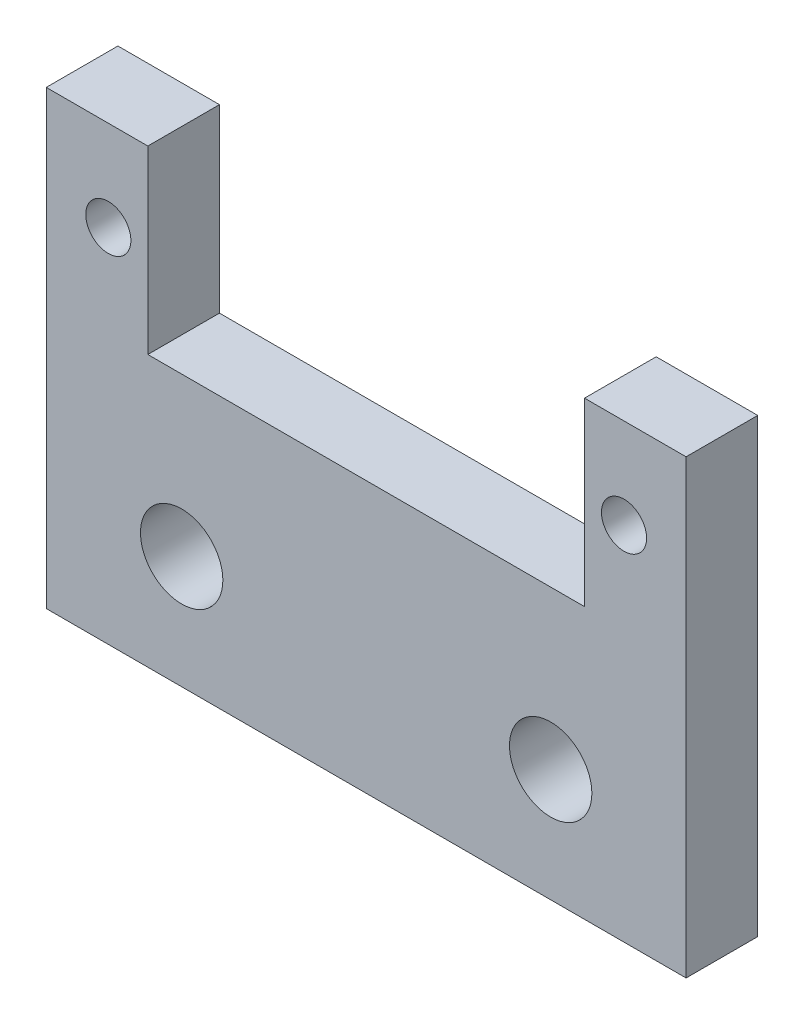
ISO-10303-21;
HEADER;
FILE_DESCRIPTION(('STEP AP214'),'2;1');
FILE_NAME('part.step','',(''),(''),'','','');
FILE_SCHEMA(('AUTOMOTIVE_DESIGN { 1 0 10303 214 1 1 1 1 }'));
ENDSEC;
DATA;
#1=APPLICATION_CONTEXT('core data for automotive mechanical design processes');
#2=APPLICATION_PROTOCOL_DEFINITION('international standard','automotive_design',2000,#1);
#3=PRODUCT_CONTEXT('',#1,'mechanical');
#4=PRODUCT('Part','Part','',(#3));
#5=PRODUCT_RELATED_PRODUCT_CATEGORY('part','',(#4));
#6=PRODUCT_DEFINITION_FORMATION('','',#4);
#7=PRODUCT_DEFINITION_CONTEXT('part definition',#1,'design');
#8=PRODUCT_DEFINITION('design','',#6,#7);
#9=PRODUCT_DEFINITION_SHAPE('','',#8);
#10=(LENGTH_UNIT() NAMED_UNIT(*) SI_UNIT(.MILLI.,.METRE.));
#11=(NAMED_UNIT(*) PLANE_ANGLE_UNIT() SI_UNIT($,.RADIAN.));
#12=(NAMED_UNIT(*) SI_UNIT($,.STERADIAN.) SOLID_ANGLE_UNIT());
#13=UNCERTAINTY_MEASURE_WITH_UNIT(LENGTH_MEASURE(1.E-05),#10,'distance_accuracy_value','');
#14=(GEOMETRIC_REPRESENTATION_CONTEXT(3) GLOBAL_UNCERTAINTY_ASSIGNED_CONTEXT((#13)) GLOBAL_UNIT_ASSIGNED_CONTEXT((#10,
#11,#12)) REPRESENTATION_CONTEXT('',''));
#15=CARTESIAN_POINT('',(0.,0.,0.));
#16=DIRECTION('',(0.,0.,1.));
#17=DIRECTION('',(1.,0.,0.));
#18=AXIS2_PLACEMENT_3D('',#15,#16,#17);
#19=CARTESIAN_POINT('',(0.,0.,3.175));
#20=DIRECTION('',(0.,0.,-1.));
#21=DIRECTION('',(-1.,0.,0.));
#22=AXIS2_PLACEMENT_3D('',#19,#20,#21);
#23=PLANE('',#22);
#24=DIRECTION('',(-1.,0.,0.));
#25=VECTOR('',#24,1.);
#26=CARTESIAN_POINT('',(0.,8.,3.175));
#27=LINE('',#26,#25);
#28=CARTESIAN_POINT('',(4.5,8.,3.175));
#29=VERTEX_POINT('',#28);
#30=CARTESIAN_POINT('',(0.,8.,3.175));
#31=VERTEX_POINT('',#30);
#32=EDGE_CURVE('E144',#29,#31,#27,.T.);
#33=ORIENTED_EDGE('',*,*,#32,.T.);
#34=DIRECTION('',(0.,-1.,0.));
#35=VECTOR('',#34,1.);
#36=CARTESIAN_POINT('',(0.,8.,3.175));
#37=LINE('',#36,#35);
#38=CARTESIAN_POINT('',(0.,-12.,3.175));
#39=VERTEX_POINT('',#38);
#40=EDGE_CURVE('E92',#31,#39,#37,.T.);
#41=ORIENTED_EDGE('',*,*,#40,.T.);
#42=DIRECTION('',(1.,0.,0.));
#43=VECTOR('',#42,1.);
#44=CARTESIAN_POINT('',(28.35,-12.,3.175));
#45=LINE('',#44,#43);
#46=CARTESIAN_POINT('',(28.35,-12.,3.175));
#47=VERTEX_POINT('',#46);
#48=EDGE_CURVE('E159',#39,#47,#45,.T.);
#49=ORIENTED_EDGE('',*,*,#48,.T.);
#50=DIRECTION('',(0.,1.,0.));
#51=VECTOR('',#50,1.);
#52=CARTESIAN_POINT('',(28.35,8.,3.175));
#53=LINE('',#52,#51);
#54=CARTESIAN_POINT('',(28.35,8.,3.175));
#55=VERTEX_POINT('',#54);
#56=EDGE_CURVE('E172',#47,#55,#53,.T.);
#57=ORIENTED_EDGE('',*,*,#56,.T.);
#58=DIRECTION('',(-1.,0.,0.));
#59=VECTOR('',#58,1.);
#60=CARTESIAN_POINT('',(23.85,8.,3.175));
#61=LINE('',#60,#59);
#62=CARTESIAN_POINT('',(23.85,8.,3.175));
#63=VERTEX_POINT('',#62);
#64=EDGE_CURVE('E111',#55,#63,#61,.T.);
#65=ORIENTED_EDGE('',*,*,#64,.T.);
#66=DIRECTION('',(0.,-1.,0.));
#67=VECTOR('',#66,1.);
#68=CARTESIAN_POINT('',(23.85,0.,3.175));
#69=LINE('',#68,#67);
#70=CARTESIAN_POINT('',(23.85,0.,3.175));
#71=VERTEX_POINT('',#70);
#72=EDGE_CURVE('E105',#63,#71,#69,.T.);
#73=ORIENTED_EDGE('',*,*,#72,.T.);
#74=DIRECTION('',(-1.,0.,0.));
#75=VECTOR('',#74,1.);
#76=CARTESIAN_POINT('',(4.5,0.,3.175));
#77=LINE('',#76,#75);
#78=CARTESIAN_POINT('',(4.5,0.,3.175));
#79=VERTEX_POINT('',#78);
#80=EDGE_CURVE('E109',#71,#79,#77,.T.);
#81=ORIENTED_EDGE('',*,*,#80,.T.);
#82=DIRECTION('',(0.,1.,0.));
#83=VECTOR('',#82,1.);
#84=CARTESIAN_POINT('',(4.5,8.,3.175));
#85=LINE('',#84,#83);
#86=EDGE_CURVE('E49',#79,#29,#85,.T.);
#87=ORIENTED_EDGE('',*,*,#86,.T.);
#88=EDGE_LOOP('',(#33,#41,#49,#57,#65,#73,#81,#87));
#89=FACE_BOUND('',#88,.T.);
#90=CARTESIAN_POINT('',(2.75,4.,3.175));
#91=DIRECTION('',(0.,0.,1.));
#92=DIRECTION('',(1.,0.,0.));
#93=AXIS2_PLACEMENT_3D('',#90,#91,#92);
#94=CIRCLE('',#93,1.);
#95=CARTESIAN_POINT('',(3.75,4.,3.175));
#96=VERTEX_POINT('',#95);
#97=EDGE_CURVE('E133',#96,#96,#94,.T.);
#98=ORIENTED_EDGE('',*,*,#97,.F.);
#99=EDGE_LOOP('',(#98));
#100=FACE_BOUND('',#99,.T.);
#101=CARTESIAN_POINT('',(25.6,4.,3.175));
#102=DIRECTION('',(0.,0.,1.));
#103=DIRECTION('',(1.,0.,0.));
#104=AXIS2_PLACEMENT_3D('',#101,#102,#103);
#105=CIRCLE('',#104,0.999999999999998);
#106=CARTESIAN_POINT('',(26.6,4.,3.175));
#107=VERTEX_POINT('',#106);
#108=EDGE_CURVE('E181',#107,#107,#105,.T.);
#109=ORIENTED_EDGE('',*,*,#108,.F.);
#110=EDGE_LOOP('',(#109));
#111=FACE_BOUND('',#110,.T.);
#112=CARTESIAN_POINT('',(6.,-7.,3.175));
#113=DIRECTION('',(0.,0.,1.));
#114=DIRECTION('',(1.,0.,0.));
#115=AXIS2_PLACEMENT_3D('',#112,#113,#114);
#116=CIRCLE('',#115,1.825);
#117=CARTESIAN_POINT('',(7.825,-7.,3.175));
#118=VERTEX_POINT('',#117);
#119=EDGE_CURVE('E187',#118,#118,#116,.T.);
#120=ORIENTED_EDGE('',*,*,#119,.F.);
#121=EDGE_LOOP('',(#120));
#122=FACE_BOUND('',#121,.T.);
#123=CARTESIAN_POINT('',(22.35,-7.,3.175));
#124=DIRECTION('',(0.,0.,1.));
#125=DIRECTION('',(1.,0.,0.));
#126=AXIS2_PLACEMENT_3D('',#123,#124,#125);
#127=CIRCLE('',#126,1.825);
#128=CARTESIAN_POINT('',(24.175,-7.,3.175));
#129=VERTEX_POINT('',#128);
#130=EDGE_CURVE('E193',#129,#129,#127,.T.);
#131=ORIENTED_EDGE('',*,*,#130,.F.);
#132=EDGE_LOOP('',(#131));
#133=FACE_BOUND('',#132,.T.);
#134=ADVANCED_FACE('F32',(#89,#100,#111,#122,#133),#23,.F.);
#135=CARTESIAN_POINT('',(0.,0.,0.));
#136=DIRECTION('',(0.,0.,-1.));
#137=DIRECTION('',(-1.,0.,0.));
#138=AXIS2_PLACEMENT_3D('',#135,#136,#137);
#139=PLANE('',#138);
#140=CARTESIAN_POINT('',(6.,-7.,0.));
#141=DIRECTION('',(0.,0.,1.));
#142=DIRECTION('',(1.,0.,0.));
#143=AXIS2_PLACEMENT_3D('',#140,#141,#142);
#144=CIRCLE('',#143,1.825);
#145=CARTESIAN_POINT('',(7.825,-7.,0.));
#146=VERTEX_POINT('',#145);
#147=EDGE_CURVE('E190',#146,#146,#144,.T.);
#148=ORIENTED_EDGE('',*,*,#147,.T.);
#149=EDGE_LOOP('',(#148));
#150=FACE_BOUND('',#149,.T.);
#151=CARTESIAN_POINT('',(2.75,4.,0.));
#152=DIRECTION('',(0.,0.,1.));
#153=DIRECTION('',(1.,0.,0.));
#154=AXIS2_PLACEMENT_3D('',#151,#152,#153);
#155=CIRCLE('',#154,1.);
#156=CARTESIAN_POINT('',(3.75,4.,0.));
#157=VERTEX_POINT('',#156);
#158=EDGE_CURVE('E178',#157,#157,#155,.T.);
#159=ORIENTED_EDGE('',*,*,#158,.T.);
#160=EDGE_LOOP('',(#159));
#161=FACE_BOUND('',#160,.T.);
#162=DIRECTION('',(-1.,0.,0.));
#163=VECTOR('',#162,1.);
#164=CARTESIAN_POINT('',(0.,8.,0.));
#165=LINE('',#164,#163);
#166=CARTESIAN_POINT('',(4.5,8.,0.));
#167=VERTEX_POINT('',#166);
#168=CARTESIAN_POINT('',(0.,8.,0.));
#169=VERTEX_POINT('',#168);
#170=EDGE_CURVE('E129',#167,#169,#165,.T.);
#171=ORIENTED_EDGE('',*,*,#170,.F.);
#172=DIRECTION('',(0.,1.,0.));
#173=VECTOR('',#172,1.);
#174=CARTESIAN_POINT('',(4.5,8.,0.));
#175=LINE('',#174,#173);
#176=CARTESIAN_POINT('',(4.5,0.,0.));
#177=VERTEX_POINT('',#176);
#178=EDGE_CURVE('E84',#177,#167,#175,.T.);
#179=ORIENTED_EDGE('',*,*,#178,.F.);
#180=DIRECTION('',(-1.,0.,0.));
#181=VECTOR('',#180,1.);
#182=CARTESIAN_POINT('',(4.5,0.,0.));
#183=LINE('',#182,#181);
#184=CARTESIAN_POINT('',(23.85,0.,0.));
#185=VERTEX_POINT('',#184);
#186=EDGE_CURVE('E78',#185,#177,#183,.T.);
#187=ORIENTED_EDGE('',*,*,#186,.F.);
#188=DIRECTION('',(0.,-1.,0.));
#189=VECTOR('',#188,1.);
#190=CARTESIAN_POINT('',(23.85,0.,0.));
#191=LINE('',#190,#189);
#192=CARTESIAN_POINT('',(23.85,8.,0.));
#193=VERTEX_POINT('',#192);
#194=EDGE_CURVE('E119',#193,#185,#191,.T.);
#195=ORIENTED_EDGE('',*,*,#194,.F.);
#196=DIRECTION('',(-1.,0.,0.));
#197=VECTOR('',#196,1.);
#198=CARTESIAN_POINT('',(23.85,8.,0.));
#199=LINE('',#198,#197);
#200=CARTESIAN_POINT('',(28.35,8.,0.));
#201=VERTEX_POINT('',#200);
#202=EDGE_CURVE('E139',#201,#193,#199,.T.);
#203=ORIENTED_EDGE('',*,*,#202,.F.);
#204=DIRECTION('',(0.,1.,0.));
#205=VECTOR('',#204,1.);
#206=CARTESIAN_POINT('',(28.35,8.,0.));
#207=LINE('',#206,#205);
#208=CARTESIAN_POINT('',(28.35,-12.,0.));
#209=VERTEX_POINT('',#208);
#210=EDGE_CURVE('E137',#209,#201,#207,.T.);
#211=ORIENTED_EDGE('',*,*,#210,.F.);
#212=DIRECTION('',(1.,0.,0.));
#213=VECTOR('',#212,1.);
#214=CARTESIAN_POINT('',(28.35,-12.,0.));
#215=LINE('',#214,#213);
#216=CARTESIAN_POINT('',(0.,-12.,0.));
#217=VERTEX_POINT('',#216);
#218=EDGE_CURVE('E135',#217,#209,#215,.T.);
#219=ORIENTED_EDGE('',*,*,#218,.F.);
#220=DIRECTION('',(0.,-1.,0.));
#221=VECTOR('',#220,1.);
#222=CARTESIAN_POINT('',(0.,-12.,0.));
#223=LINE('',#222,#221);
#224=EDGE_CURVE('E132',#169,#217,#223,.T.);
#225=ORIENTED_EDGE('',*,*,#224,.F.);
#226=EDGE_LOOP('',(#171,#179,#187,#195,#203,#211,#219,#225));
#227=FACE_BOUND('',#226,.T.);
#228=CARTESIAN_POINT('',(25.6,4.,0.));
#229=DIRECTION('',(0.,0.,1.));
#230=DIRECTION('',(1.,0.,0.));
#231=AXIS2_PLACEMENT_3D('',#228,#229,#230);
#232=CIRCLE('',#231,0.999999999999998);
#233=CARTESIAN_POINT('',(26.6,4.,0.));
#234=VERTEX_POINT('',#233);
#235=EDGE_CURVE('E184',#234,#234,#232,.T.);
#236=ORIENTED_EDGE('',*,*,#235,.T.);
#237=EDGE_LOOP('',(#236));
#238=FACE_BOUND('',#237,.T.);
#239=CARTESIAN_POINT('',(22.35,-7.,0.));
#240=DIRECTION('',(0.,0.,1.));
#241=DIRECTION('',(1.,0.,0.));
#242=AXIS2_PLACEMENT_3D('',#239,#240,#241);
#243=CIRCLE('',#242,1.825);
#244=CARTESIAN_POINT('',(24.175,-7.,0.));
#245=VERTEX_POINT('',#244);
#246=EDGE_CURVE('E196',#245,#245,#243,.T.);
#247=ORIENTED_EDGE('',*,*,#246,.T.);
#248=EDGE_LOOP('',(#247));
#249=FACE_BOUND('',#248,.T.);
#250=ADVANCED_FACE('F163',(#150,#161,#227,#238,#249),#139,.T.);
#251=CARTESIAN_POINT('',(0.,8.,3.175));
#252=DIRECTION('',(0.,-1.,0.));
#253=DIRECTION('',(0.,0.,-1.));
#254=AXIS2_PLACEMENT_3D('',#251,#252,#253);
#255=PLANE('',#254);
#256=ORIENTED_EDGE('',*,*,#170,.T.);
#257=DIRECTION('',(0.,0.,-1.));
#258=VECTOR('',#257,1.);
#259=CARTESIAN_POINT('',(0.,8.,3.175));
#260=LINE('',#259,#258);
#261=EDGE_CURVE('E11',#31,#169,#260,.T.);
#262=ORIENTED_EDGE('',*,*,#261,.F.);
#263=ORIENTED_EDGE('',*,*,#32,.F.);
#264=DIRECTION('',(0.,0.,-1.));
#265=VECTOR('',#264,1.);
#266=CARTESIAN_POINT('',(4.5,8.,3.175));
#267=LINE('',#266,#265);
#268=EDGE_CURVE('E125',#29,#167,#267,.T.);
#269=ORIENTED_EDGE('',*,*,#268,.T.);
#270=EDGE_LOOP('',(#256,#262,#263,#269));
#271=FACE_BOUND('',#270,.T.);
#272=ADVANCED_FACE('F34',(#271),#255,.F.);
#273=CARTESIAN_POINT('',(0.,-12.,3.175));
#274=DIRECTION('',(1.,0.,0.));
#275=DIRECTION('',(0.,0.,-1.));
#276=AXIS2_PLACEMENT_3D('',#273,#274,#275);
#277=PLANE('',#276);
#278=ORIENTED_EDGE('',*,*,#224,.T.);
#279=DIRECTION('',(0.,0.,-1.));
#280=VECTOR('',#279,1.);
#281=CARTESIAN_POINT('',(0.,-12.,3.175));
#282=LINE('',#281,#280);
#283=EDGE_CURVE('E41',#39,#217,#282,.T.);
#284=ORIENTED_EDGE('',*,*,#283,.F.);
#285=ORIENTED_EDGE('',*,*,#40,.F.);
#286=ORIENTED_EDGE('',*,*,#261,.T.);
#287=EDGE_LOOP('',(#278,#284,#285,#286));
#288=FACE_BOUND('',#287,.T.);
#289=ADVANCED_FACE('F228',(#288),#277,.F.);
#290=CARTESIAN_POINT('',(28.35,-12.,3.175));
#291=DIRECTION('',(0.,1.,0.));
#292=DIRECTION('',(-1.,0.,0.));
#293=AXIS2_PLACEMENT_3D('',#290,#291,#292);
#294=PLANE('',#293);
#295=ORIENTED_EDGE('',*,*,#218,.T.);
#296=DIRECTION('',(0.,0.,-1.));
#297=VECTOR('',#296,1.);
#298=CARTESIAN_POINT('',(28.35,-12.,3.175));
#299=LINE('',#298,#297);
#300=EDGE_CURVE('E151',#47,#209,#299,.T.);
#301=ORIENTED_EDGE('',*,*,#300,.F.);
#302=ORIENTED_EDGE('',*,*,#48,.F.);
#303=ORIENTED_EDGE('',*,*,#283,.T.);
#304=EDGE_LOOP('',(#295,#301,#302,#303));
#305=FACE_BOUND('',#304,.T.);
#306=ADVANCED_FACE('F157',(#305),#294,.F.);
#307=CARTESIAN_POINT('',(28.35,8.,3.175));
#308=DIRECTION('',(-1.,0.,0.));
#309=DIRECTION('',(0.,-1.,0.));
#310=AXIS2_PLACEMENT_3D('',#307,#308,#309);
#311=PLANE('',#310);
#312=ORIENTED_EDGE('',*,*,#210,.T.);
#313=DIRECTION('',(0.,0.,-1.));
#314=VECTOR('',#313,1.);
#315=CARTESIAN_POINT('',(28.35,8.,3.175));
#316=LINE('',#315,#314);
#317=EDGE_CURVE('E148',#55,#201,#316,.T.);
#318=ORIENTED_EDGE('',*,*,#317,.F.);
#319=ORIENTED_EDGE('',*,*,#56,.F.);
#320=ORIENTED_EDGE('',*,*,#300,.T.);
#321=EDGE_LOOP('',(#312,#318,#319,#320));
#322=FACE_BOUND('',#321,.T.);
#323=ADVANCED_FACE('F168',(#322),#311,.F.);
#324=CARTESIAN_POINT('',(23.85,8.,3.175));
#325=DIRECTION('',(0.,-1.,0.));
#326=DIRECTION('',(0.,0.,-1.));
#327=AXIS2_PLACEMENT_3D('',#324,#325,#326);
#328=PLANE('',#327);
#329=ORIENTED_EDGE('',*,*,#202,.T.);
#330=DIRECTION('',(0.,0.,-1.));
#331=VECTOR('',#330,1.);
#332=CARTESIAN_POINT('',(23.85,8.,3.175));
#333=LINE('',#332,#331);
#334=EDGE_CURVE('E120',#63,#193,#333,.T.);
#335=ORIENTED_EDGE('',*,*,#334,.F.);
#336=ORIENTED_EDGE('',*,*,#64,.F.);
#337=ORIENTED_EDGE('',*,*,#317,.T.);
#338=EDGE_LOOP('',(#329,#335,#336,#337));
#339=FACE_BOUND('',#338,.T.);
#340=ADVANCED_FACE('F171',(#339),#328,.F.);
#341=CARTESIAN_POINT('',(23.85,0.,3.175));
#342=DIRECTION('',(1.,0.,0.));
#343=DIRECTION('',(0.,0.,-1.));
#344=AXIS2_PLACEMENT_3D('',#341,#342,#343);
#345=PLANE('',#344);
#346=ORIENTED_EDGE('',*,*,#194,.T.);
#347=DIRECTION('',(0.,0.,-1.));
#348=VECTOR('',#347,1.);
#349=CARTESIAN_POINT('',(23.85,0.,3.175));
#350=LINE('',#349,#348);
#351=EDGE_CURVE('E116',#71,#185,#350,.T.);
#352=ORIENTED_EDGE('',*,*,#351,.F.);
#353=ORIENTED_EDGE('',*,*,#72,.F.);
#354=ORIENTED_EDGE('',*,*,#334,.T.);
#355=EDGE_LOOP('',(#346,#352,#353,#354));
#356=FACE_BOUND('',#355,.T.);
#357=ADVANCED_FACE('F117',(#356),#345,.F.);
#358=CARTESIAN_POINT('',(4.5,0.,3.175));
#359=DIRECTION('',(0.,-1.,0.));
#360=DIRECTION('',(0.,0.,-1.));
#361=AXIS2_PLACEMENT_3D('',#358,#359,#360);
#362=PLANE('',#361);
#363=ORIENTED_EDGE('',*,*,#186,.T.);
#364=DIRECTION('',(0.,0.,-1.));
#365=VECTOR('',#364,1.);
#366=CARTESIAN_POINT('',(4.5,0.,3.175));
#367=LINE('',#366,#365);
#368=EDGE_CURVE('E121',#79,#177,#367,.T.);
#369=ORIENTED_EDGE('',*,*,#368,.F.);
#370=ORIENTED_EDGE('',*,*,#80,.F.);
#371=ORIENTED_EDGE('',*,*,#351,.T.);
#372=EDGE_LOOP('',(#363,#369,#370,#371));
#373=FACE_BOUND('',#372,.T.);
#374=ADVANCED_FACE('F123',(#373),#362,.F.);
#375=CARTESIAN_POINT('',(4.5,8.,3.175));
#376=DIRECTION('',(-1.,0.,0.));
#377=DIRECTION('',(0.,0.,1.));
#378=AXIS2_PLACEMENT_3D('',#375,#376,#377);
#379=PLANE('',#378);
#380=ORIENTED_EDGE('',*,*,#178,.T.);
#381=ORIENTED_EDGE('',*,*,#268,.F.);
#382=ORIENTED_EDGE('',*,*,#86,.F.);
#383=ORIENTED_EDGE('',*,*,#368,.T.);
#384=EDGE_LOOP('',(#380,#381,#382,#383));
#385=FACE_BOUND('',#384,.T.);
#386=ADVANCED_FACE('F216',(#385),#379,.F.);
#387=CARTESIAN_POINT('',(2.75,4.,3.175));
#388=DIRECTION('',(0.,0.,-1.));
#389=DIRECTION('',(-1.,0.,0.));
#390=AXIS2_PLACEMENT_3D('',#387,#388,#389);
#391=CYLINDRICAL_SURFACE('',#390,1.);
#392=ORIENTED_EDGE('',*,*,#97,.T.);
#393=EDGE_LOOP('',(#392));
#394=FACE_BOUND('',#393,.T.);
#395=ORIENTED_EDGE('',*,*,#158,.F.);
#396=EDGE_LOOP('',(#395));
#397=FACE_BOUND('',#396,.T.);
#398=ADVANCED_FACE('F213',(#394,#397),#391,.F.);
#399=CARTESIAN_POINT('',(25.6,4.,3.175));
#400=DIRECTION('',(0.,0.,-1.));
#401=DIRECTION('',(-1.,0.,0.));
#402=AXIS2_PLACEMENT_3D('',#399,#400,#401);
#403=CYLINDRICAL_SURFACE('',#402,0.999999999999998);
#404=ORIENTED_EDGE('',*,*,#108,.T.);
#405=EDGE_LOOP('',(#404));
#406=FACE_BOUND('',#405,.T.);
#407=ORIENTED_EDGE('',*,*,#235,.F.);
#408=EDGE_LOOP('',(#407));
#409=FACE_BOUND('',#408,.T.);
#410=ADVANCED_FACE('F295',(#406,#409),#403,.F.);
#411=CARTESIAN_POINT('',(6.,-7.,3.175));
#412=DIRECTION('',(0.,0.,-1.));
#413=DIRECTION('',(-1.,0.,0.));
#414=AXIS2_PLACEMENT_3D('',#411,#412,#413);
#415=CYLINDRICAL_SURFACE('',#414,1.825);
#416=ORIENTED_EDGE('',*,*,#119,.T.);
#417=EDGE_LOOP('',(#416));
#418=FACE_BOUND('',#417,.T.);
#419=ORIENTED_EDGE('',*,*,#147,.F.);
#420=EDGE_LOOP('',(#419));
#421=FACE_BOUND('',#420,.T.);
#422=ADVANCED_FACE('F303',(#418,#421),#415,.F.);
#423=CARTESIAN_POINT('',(22.35,-7.,3.175));
#424=DIRECTION('',(0.,0.,-1.));
#425=DIRECTION('',(-1.,0.,0.));
#426=AXIS2_PLACEMENT_3D('',#423,#424,#425);
#427=CYLINDRICAL_SURFACE('',#426,1.825);
#428=ORIENTED_EDGE('',*,*,#130,.T.);
#429=EDGE_LOOP('',(#428));
#430=FACE_BOUND('',#429,.T.);
#431=ORIENTED_EDGE('',*,*,#246,.F.);
#432=EDGE_LOOP('',(#431));
#433=FACE_BOUND('',#432,.T.);
#434=ADVANCED_FACE('F202',(#430,#433),#427,.F.);
#435=CLOSED_SHELL('',(#134,#250,#272,#289,#306,#323,#340,#357,#374,#386,#398,#410,#422,#434));
#436=MANIFOLD_SOLID_BREP('B2',#435);
#437=ADVANCED_BREP_SHAPE_REPRESENTATION('',(#18,#436),#14);
#438=SHAPE_DEFINITION_REPRESENTATION(#9,#437);
ENDSEC;
END-ISO-10303-21;
